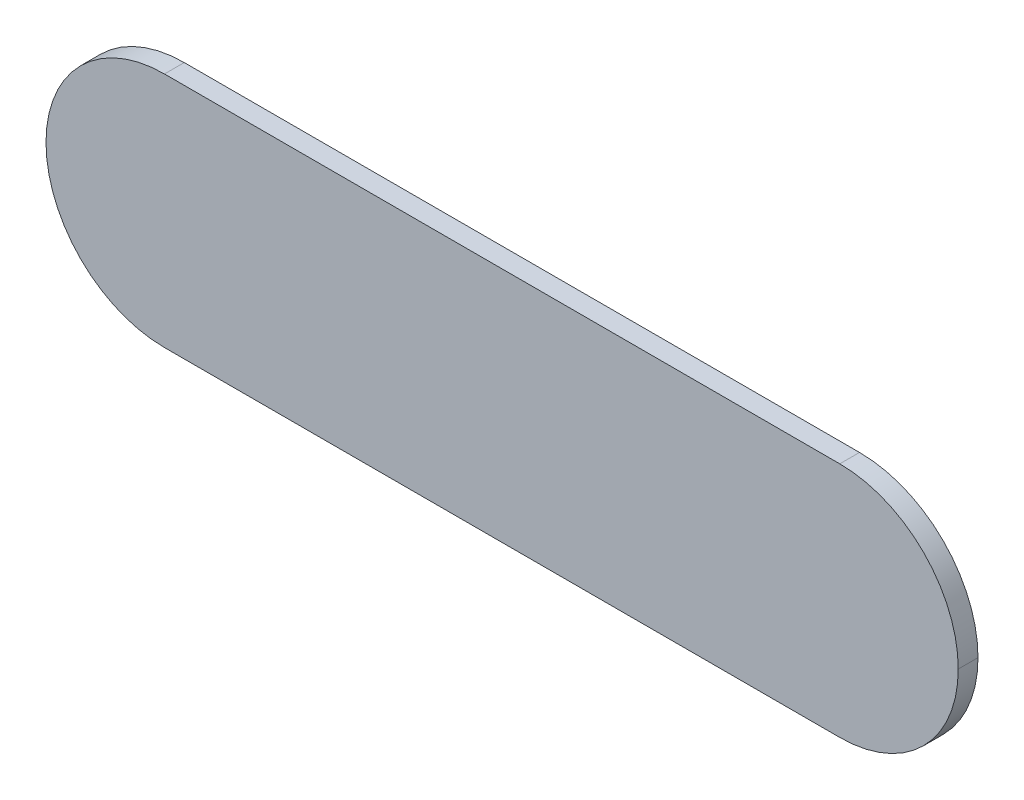
ISO-10303-21;
HEADER;
FILE_DESCRIPTION(('STEP AP214'),'2;1');
FILE_NAME('part.step','',(''),(''),'','','');
FILE_SCHEMA(('AUTOMOTIVE_DESIGN { 1 0 10303 214 1 1 1 1 }'));
ENDSEC;
DATA;
#1=APPLICATION_CONTEXT('core data for automotive mechanical design processes');
#2=APPLICATION_PROTOCOL_DEFINITION('international standard','automotive_design',2000,#1);
#3=PRODUCT_CONTEXT('',#1,'mechanical');
#4=PRODUCT('Part','Part','',(#3));
#5=PRODUCT_RELATED_PRODUCT_CATEGORY('part','',(#4));
#6=PRODUCT_DEFINITION_FORMATION('','',#4);
#7=PRODUCT_DEFINITION_CONTEXT('part definition',#1,'design');
#8=PRODUCT_DEFINITION('design','',#6,#7);
#9=PRODUCT_DEFINITION_SHAPE('','',#8);
#10=(LENGTH_UNIT() NAMED_UNIT(*) SI_UNIT(.MILLI.,.METRE.));
#11=(NAMED_UNIT(*) PLANE_ANGLE_UNIT() SI_UNIT($,.RADIAN.));
#12=(NAMED_UNIT(*) SI_UNIT($,.STERADIAN.) SOLID_ANGLE_UNIT());
#13=UNCERTAINTY_MEASURE_WITH_UNIT(LENGTH_MEASURE(1.E-05),#10,'distance_accuracy_value','');
#14=(GEOMETRIC_REPRESENTATION_CONTEXT(3) GLOBAL_UNCERTAINTY_ASSIGNED_CONTEXT((#13)) GLOBAL_UNIT_ASSIGNED_CONTEXT((#10,
#11,#12)) REPRESENTATION_CONTEXT('',''));
#15=CARTESIAN_POINT('',(0.,0.,0.));
#16=DIRECTION('',(0.,0.,1.));
#17=DIRECTION('',(1.,0.,0.));
#18=AXIS2_PLACEMENT_3D('',#15,#16,#17);
#19=CARTESIAN_POINT('',(38.070148925781,53.566999511719,1.1723000001));
#20=DIRECTION('',(0.,0.,1.));
#21=DIRECTION('',(1.,0.,0.));
#22=AXIS2_PLACEMENT_3D('',#19,#20,#21);
#23=PLANE('',#22);
#24=CARTESIAN_POINT('',(37.852998046836,53.566999511719,1.1723000001));
#25=DIRECTION('',(0.,0.,-1.));
#26=DIRECTION('',(1.,0.,0.));
#27=AXIS2_PLACEMENT_3D('',#24,#25,#26);
#28=CIRCLE('',#27,0.07619873046875);
#29=CARTESIAN_POINT('',(37.852998046855,53.49080078125,1.1723000001));
#30=VERTEX_POINT('',#29);
#31=CARTESIAN_POINT('',(37.852998046855,53.643198242187,1.1723000001));
#32=VERTEX_POINT('',#31);
#33=EDGE_CURVE('E109',#30,#32,#28,.T.);
#34=ORIENTED_EDGE('',*,*,#33,.F.);
#35=DIRECTION('',(1.,0.,0.));
#36=VECTOR('',#35,1.);
#37=CARTESIAN_POINT('',(38.287299804688,53.49080078125,1.1723000001));
#38=LINE('',#37,#36);
#39=CARTESIAN_POINT('',(38.287299804707,53.49080078125,1.1723000001));
#40=VERTEX_POINT('',#39);
#41=EDGE_CURVE('E106',#30,#40,#38,.T.);
#42=ORIENTED_EDGE('',*,*,#41,.T.);
#43=CARTESIAN_POINT('',(38.287299804727,53.566999511719,1.1723000001));
#44=DIRECTION('',(0.,0.,-1.));
#45=DIRECTION('',(1.,0.,0.));
#46=AXIS2_PLACEMENT_3D('',#43,#44,#45);
#47=CIRCLE('',#46,0.07619873046875);
#48=CARTESIAN_POINT('',(38.363498535195,53.566999511719,1.1723000001));
#49=VERTEX_POINT('',#48);
#50=EDGE_CURVE('E77',#49,#40,#47,.T.);
#51=ORIENTED_EDGE('',*,*,#50,.F.);
#52=CARTESIAN_POINT('',(38.287299804727,53.566999511719,1.1723000001));
#53=DIRECTION('',(0.,0.,-1.));
#54=DIRECTION('',(1.,0.,0.));
#55=AXIS2_PLACEMENT_3D('',#52,#53,#54);
#56=CIRCLE('',#55,0.07619873046875);
#57=CARTESIAN_POINT('',(38.287299804707,53.643198242187,1.1723000001));
#58=VERTEX_POINT('',#57);
#59=EDGE_CURVE('E74',#58,#49,#56,.T.);
#60=ORIENTED_EDGE('',*,*,#59,.F.);
#61=DIRECTION('',(-1.,0.,0.));
#62=VECTOR('',#61,1.);
#63=CARTESIAN_POINT('',(37.852998046875,53.643198242188,1.1723000001));
#64=LINE('',#63,#62);
#65=EDGE_CURVE('E11',#58,#32,#64,.T.);
#66=ORIENTED_EDGE('',*,*,#65,.T.);
#67=EDGE_LOOP('',(#34,#42,#51,#60,#66));
#68=FACE_BOUND('',#67,.T.);
#69=ADVANCED_FACE('F17',(#68),#23,.T.);
#70=CARTESIAN_POINT('',(37.852998046875,53.643198242188,1.1596000001));
#71=DIRECTION('',(0.,-1.,0.));
#72=DIRECTION('',(0.,0.,-1.));
#73=AXIS2_PLACEMENT_3D('',#70,#71,#72);
#74=PLANE('',#73);
#75=DIRECTION('',(0.,0.,1.));
#76=VECTOR('',#75,1.);
#77=CARTESIAN_POINT('',(38.287299804688,53.643198242187,1.1596000001));
#78=LINE('',#77,#76);
#79=CARTESIAN_POINT('',(38.287299804707,53.643198242187,1.1596000001));
#80=VERTEX_POINT('',#79);
#81=EDGE_CURVE('E21',#80,#58,#78,.T.);
#82=ORIENTED_EDGE('',*,*,#81,.F.);
#83=DIRECTION('',(-1.,0.,0.));
#84=VECTOR('',#83,1.);
#85=CARTESIAN_POINT('',(38.070148925781,53.643198242188,1.1596000001));
#86=LINE('',#85,#84);
#87=CARTESIAN_POINT('',(37.852998046855,53.643198242187,1.1596000001));
#88=VERTEX_POINT('',#87);
#89=EDGE_CURVE('E92',#80,#88,#86,.T.);
#90=ORIENTED_EDGE('',*,*,#89,.T.);
#91=DIRECTION('',(0.,0.,-1.));
#92=VECTOR('',#91,1.);
#93=CARTESIAN_POINT('',(37.852998046875,53.643198242187,1.1596000001));
#94=LINE('',#93,#92);
#95=EDGE_CURVE('E28',#32,#88,#94,.T.);
#96=ORIENTED_EDGE('',*,*,#95,.F.);
#97=ORIENTED_EDGE('',*,*,#65,.F.);
#98=EDGE_LOOP('',(#82,#90,#96,#97));
#99=FACE_BOUND('',#98,.T.);
#100=ADVANCED_FACE('F68',(#99),#74,.F.);
#101=CARTESIAN_POINT('',(37.852998046836,53.566999511719,1.1596000001));
#102=DIRECTION('',(0.,0.,1.));
#103=DIRECTION('',(1.,0.,0.));
#104=AXIS2_PLACEMENT_3D('',#101,#102,#103);
#105=CYLINDRICAL_SURFACE('',#104,0.07619873046875);
#106=CARTESIAN_POINT('',(37.852998046836,53.566999511719,1.1596000001));
#107=DIRECTION('',(0.,0.,1.));
#108=DIRECTION('',(1.,0.,0.));
#109=AXIS2_PLACEMENT_3D('',#106,#107,#108);
#110=CIRCLE('',#109,0.07619873046875);
#111=CARTESIAN_POINT('',(37.852998046855,53.49080078125,1.1596000001));
#112=VERTEX_POINT('',#111);
#113=EDGE_CURVE('E97',#88,#112,#110,.T.);
#114=ORIENTED_EDGE('',*,*,#113,.T.);
#115=DIRECTION('',(0.,0.,1.));
#116=VECTOR('',#115,1.);
#117=CARTESIAN_POINT('',(37.852998046875,53.49080078125,1.1596000001));
#118=LINE('',#117,#116);
#119=EDGE_CURVE('E82',#112,#30,#118,.T.);
#120=ORIENTED_EDGE('',*,*,#119,.T.);
#121=ORIENTED_EDGE('',*,*,#33,.T.);
#122=ORIENTED_EDGE('',*,*,#95,.T.);
#123=EDGE_LOOP('',(#114,#120,#121,#122));
#124=FACE_BOUND('',#123,.T.);
#125=ADVANCED_FACE('F137',(#124),#105,.T.);
#126=CARTESIAN_POINT('',(38.287299804688,53.49080078125,1.1596000001));
#127=DIRECTION('',(0.,1.,0.));
#128=DIRECTION('',(1.,0.,0.));
#129=AXIS2_PLACEMENT_3D('',#126,#127,#128);
#130=PLANE('',#129);
#131=ORIENTED_EDGE('',*,*,#119,.F.);
#132=DIRECTION('',(1.,0.,0.));
#133=VECTOR('',#132,1.);
#134=CARTESIAN_POINT('',(38.070148925781,53.49080078125,1.1596000001));
#135=LINE('',#134,#133);
#136=CARTESIAN_POINT('',(38.287299804707,53.49080078125,1.1596000001));
#137=VERTEX_POINT('',#136);
#138=EDGE_CURVE('E105',#112,#137,#135,.T.);
#139=ORIENTED_EDGE('',*,*,#138,.T.);
#140=DIRECTION('',(0.,0.,-1.));
#141=VECTOR('',#140,1.);
#142=CARTESIAN_POINT('',(38.287299804688,53.49080078125,1.1596000001));
#143=LINE('',#142,#141);
#144=EDGE_CURVE('E101',#40,#137,#143,.T.);
#145=ORIENTED_EDGE('',*,*,#144,.F.);
#146=ORIENTED_EDGE('',*,*,#41,.F.);
#147=EDGE_LOOP('',(#131,#139,#145,#146));
#148=FACE_BOUND('',#147,.T.);
#149=ADVANCED_FACE('F141',(#148),#130,.F.);
#150=CARTESIAN_POINT('',(38.287299804727,53.566999511719,1.1596000001));
#151=DIRECTION('',(0.,0.,1.));
#152=DIRECTION('',(1.,0.,0.));
#153=AXIS2_PLACEMENT_3D('',#150,#151,#152);
#154=CYLINDRICAL_SURFACE('',#153,0.07619873046875);
#155=DIRECTION('',(0.,0.,1.));
#156=VECTOR('',#155,1.);
#157=CARTESIAN_POINT('',(38.363498535195,53.566999511719,1.1596000001));
#158=LINE('',#157,#156);
#159=CARTESIAN_POINT('',(38.363498535195,53.566999511719,1.1596000001));
#160=VERTEX_POINT('',#159);
#161=EDGE_CURVE('E112',#160,#49,#158,.T.);
#162=ORIENTED_EDGE('',*,*,#161,.F.);
#163=CARTESIAN_POINT('',(38.287299804727,53.566999511719,1.1596000001));
#164=DIRECTION('',(0.,0.,1.));
#165=DIRECTION('',(1.,0.,0.));
#166=AXIS2_PLACEMENT_3D('',#163,#164,#165);
#167=CIRCLE('',#166,0.07619873046875);
#168=EDGE_CURVE('E85',#160,#80,#167,.T.);
#169=ORIENTED_EDGE('',*,*,#168,.T.);
#170=ORIENTED_EDGE('',*,*,#81,.T.);
#171=ORIENTED_EDGE('',*,*,#59,.T.);
#172=EDGE_LOOP('',(#162,#169,#170,#171));
#173=FACE_BOUND('',#172,.T.);
#174=ADVANCED_FACE('F19',(#173),#154,.T.);
#175=CARTESIAN_POINT('',(38.070148925781,53.566999511719,1.1596000001));
#176=DIRECTION('',(0.,0.,1.));
#177=DIRECTION('',(1.,0.,0.));
#178=AXIS2_PLACEMENT_3D('',#175,#176,#177);
#179=PLANE('',#178);
#180=ORIENTED_EDGE('',*,*,#138,.F.);
#181=ORIENTED_EDGE('',*,*,#113,.F.);
#182=ORIENTED_EDGE('',*,*,#89,.F.);
#183=ORIENTED_EDGE('',*,*,#168,.F.);
#184=CARTESIAN_POINT('',(38.287299804727,53.566999511719,1.1596000001));
#185=DIRECTION('',(0.,0.,1.));
#186=DIRECTION('',(1.,0.,0.));
#187=AXIS2_PLACEMENT_3D('',#184,#185,#186);
#188=CIRCLE('',#187,0.07619873046875);
#189=EDGE_CURVE('E120',#137,#160,#188,.T.);
#190=ORIENTED_EDGE('',*,*,#189,.F.);
#191=EDGE_LOOP('',(#180,#181,#182,#183,#190));
#192=FACE_BOUND('',#191,.T.);
#193=ADVANCED_FACE('F145',(#192),#179,.F.);
#194=CARTESIAN_POINT('',(38.287299804727,53.566999511719,1.1596000001));
#195=DIRECTION('',(0.,0.,1.));
#196=DIRECTION('',(1.,0.,0.));
#197=AXIS2_PLACEMENT_3D('',#194,#195,#196);
#198=CYLINDRICAL_SURFACE('',#197,0.07619873046875);
#199=ORIENTED_EDGE('',*,*,#189,.T.);
#200=ORIENTED_EDGE('',*,*,#161,.T.);
#201=ORIENTED_EDGE('',*,*,#50,.T.);
#202=ORIENTED_EDGE('',*,*,#144,.T.);
#203=EDGE_LOOP('',(#199,#200,#201,#202));
#204=FACE_BOUND('',#203,.T.);
#205=ADVANCED_FACE('F143',(#204),#198,.T.);
#206=CLOSED_SHELL('',(#69,#100,#125,#149,#174,#193,#205));
#207=MANIFOLD_SOLID_BREP('B1',#206);
#208=ADVANCED_BREP_SHAPE_REPRESENTATION('',(#18,#207),#14);
#209=SHAPE_DEFINITION_REPRESENTATION(#9,#208);
ENDSEC;
END-ISO-10303-21;
